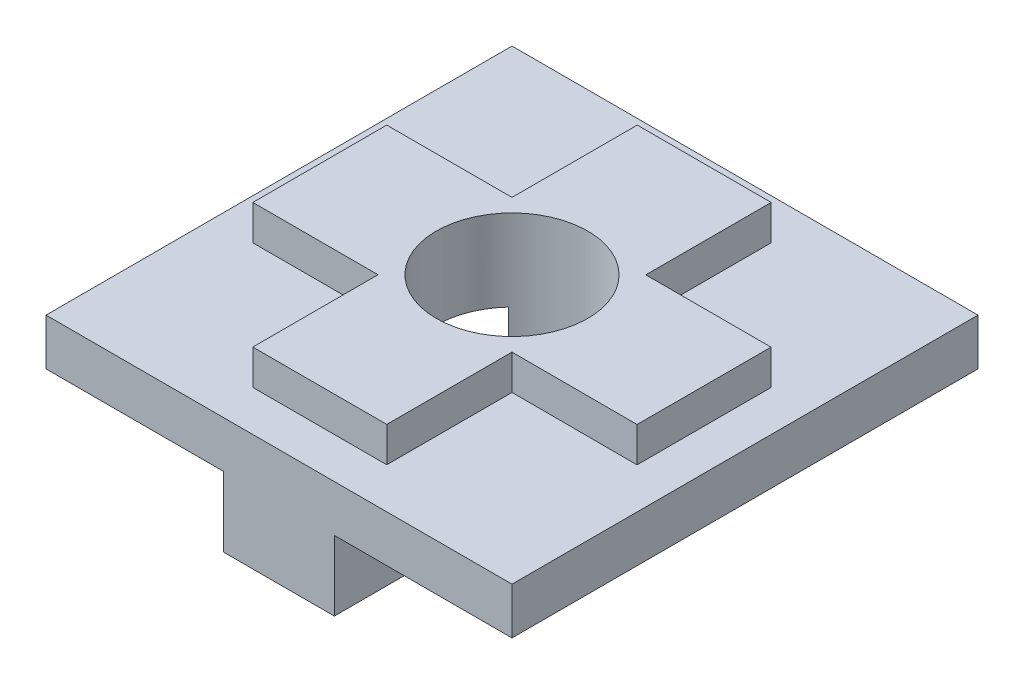
ISO-10303-21;
HEADER;
FILE_DESCRIPTION(('STEP AP214'),'2;1');
FILE_NAME('part.step','',(''),(''),'','','');
FILE_SCHEMA(('AUTOMOTIVE_DESIGN { 1 0 10303 214 1 1 1 1 }'));
ENDSEC;
DATA;
#1=APPLICATION_CONTEXT('core data for automotive mechanical design processes');
#2=APPLICATION_PROTOCOL_DEFINITION('international standard','automotive_design',2000,#1);
#3=PRODUCT_CONTEXT('',#1,'mechanical');
#4=PRODUCT('Part','Part','',(#3));
#5=PRODUCT_RELATED_PRODUCT_CATEGORY('part','',(#4));
#6=PRODUCT_DEFINITION_FORMATION('','',#4);
#7=PRODUCT_DEFINITION_CONTEXT('part definition',#1,'design');
#8=PRODUCT_DEFINITION('design','',#6,#7);
#9=PRODUCT_DEFINITION_SHAPE('','',#8);
#10=(LENGTH_UNIT() NAMED_UNIT(*) SI_UNIT(.MILLI.,.METRE.));
#11=(NAMED_UNIT(*) PLANE_ANGLE_UNIT() SI_UNIT($,.RADIAN.));
#12=(NAMED_UNIT(*) SI_UNIT($,.STERADIAN.) SOLID_ANGLE_UNIT());
#13=UNCERTAINTY_MEASURE_WITH_UNIT(LENGTH_MEASURE(1.E-05),#10,'distance_accuracy_value','');
#14=(GEOMETRIC_REPRESENTATION_CONTEXT(3) GLOBAL_UNCERTAINTY_ASSIGNED_CONTEXT((#13)) GLOBAL_UNIT_ASSIGNED_CONTEXT((#10,
#11,#12)) REPRESENTATION_CONTEXT('',''));
#15=CARTESIAN_POINT('',(0.,0.,0.));
#16=DIRECTION('',(0.,0.,1.));
#17=DIRECTION('',(1.,0.,0.));
#18=AXIS2_PLACEMENT_3D('',#15,#16,#17);
#19=CARTESIAN_POINT('',(2.375,-3.,10.));
#20=DIRECTION('',(-1.,0.,0.));
#21=DIRECTION('',(0.,0.,1.));
#22=AXIS2_PLACEMENT_3D('',#19,#20,#21);
#23=PLANE('',#22);
#24=DIRECTION('',(0.,0.,1.));
#25=VECTOR('',#24,1.);
#26=CARTESIAN_POINT('',(2.375,-3.,10.));
#27=LINE('',#26,#25);
#28=CARTESIAN_POINT('',(2.375,-3.,2.21852991866235));
#29=VERTEX_POINT('',#28);
#30=CARTESIAN_POINT('',(2.375,-3.,10.));
#31=VERTEX_POINT('',#30);
#32=EDGE_CURVE('E227',#29,#31,#27,.T.);
#33=ORIENTED_EDGE('',*,*,#32,.F.);
#34=DIRECTION('',(0.,1.,0.));
#35=VECTOR('',#34,1.);
#36=CARTESIAN_POINT('',(2.375,3.5,2.21852991866236));
#37=LINE('',#36,#35);
#38=CARTESIAN_POINT('',(2.375,0.,2.21852991866236));
#39=VERTEX_POINT('',#38);
#40=EDGE_CURVE('E55',#29,#39,#37,.T.);
#41=ORIENTED_EDGE('',*,*,#40,.T.);
#42=DIRECTION('',(0.,0.,1.));
#43=VECTOR('',#42,1.);
#44=CARTESIAN_POINT('',(2.375,0.,10.));
#45=LINE('',#44,#43);
#46=CARTESIAN_POINT('',(2.375,0.,10.));
#47=VERTEX_POINT('',#46);
#48=EDGE_CURVE('E247',#39,#47,#45,.T.);
#49=ORIENTED_EDGE('',*,*,#48,.T.);
#50=DIRECTION('',(0.,1.,0.));
#51=VECTOR('',#50,1.);
#52=CARTESIAN_POINT('',(2.375,-3.,10.));
#53=LINE('',#52,#51);
#54=EDGE_CURVE('E261',#31,#47,#53,.T.);
#55=ORIENTED_EDGE('',*,*,#54,.F.);
#56=EDGE_LOOP('',(#33,#41,#49,#55));
#57=FACE_BOUND('',#56,.T.);
#58=ADVANCED_FACE('F39',(#57),#23,.F.);
#59=CARTESIAN_POINT('',(-2.375,-3.,10.));
#60=DIRECTION('',(1.,0.,0.));
#61=DIRECTION('',(0.,0.,-1.));
#62=AXIS2_PLACEMENT_3D('',#59,#60,#61);
#63=PLANE('',#62);
#64=DIRECTION('',(0.,0.,-1.));
#65=VECTOR('',#64,1.);
#66=CARTESIAN_POINT('',(-2.375,-3.,10.));
#67=LINE('',#66,#65);
#68=CARTESIAN_POINT('',(-2.375,-3.,-2.21852991866235));
#69=VERTEX_POINT('',#68);
#70=CARTESIAN_POINT('',(-2.375,-3.,-10.));
#71=VERTEX_POINT('',#70);
#72=EDGE_CURVE('E231',#69,#71,#67,.T.);
#73=ORIENTED_EDGE('',*,*,#72,.F.);
#74=DIRECTION('',(0.,1.,0.));
#75=VECTOR('',#74,1.);
#76=CARTESIAN_POINT('',(-2.375,3.5,-2.21852991866236));
#77=LINE('',#76,#75);
#78=CARTESIAN_POINT('',(-2.375,0.,-2.21852991866236));
#79=VERTEX_POINT('',#78);
#80=EDGE_CURVE('E205',#69,#79,#77,.T.);
#81=ORIENTED_EDGE('',*,*,#80,.T.);
#82=DIRECTION('',(0.,0.,-1.));
#83=VECTOR('',#82,1.);
#84=CARTESIAN_POINT('',(-2.375,0.,10.));
#85=LINE('',#84,#83);
#86=CARTESIAN_POINT('',(-2.375,0.,-10.));
#87=VERTEX_POINT('',#86);
#88=EDGE_CURVE('E246',#79,#87,#85,.T.);
#89=ORIENTED_EDGE('',*,*,#88,.T.);
#90=DIRECTION('',(0.,1.,0.));
#91=VECTOR('',#90,1.);
#92=CARTESIAN_POINT('',(-2.375,-3.,-10.));
#93=LINE('',#92,#91);
#94=EDGE_CURVE('E253',#71,#87,#93,.T.);
#95=ORIENTED_EDGE('',*,*,#94,.F.);
#96=EDGE_LOOP('',(#73,#81,#89,#95));
#97=FACE_BOUND('',#96,.T.);
#98=ADVANCED_FACE('F474',(#97),#63,.F.);
#99=CARTESIAN_POINT('',(0.,-3.,0.));
#100=DIRECTION('',(0.,-1.,0.));
#101=DIRECTION('',(0.,0.,-1.));
#102=AXIS2_PLACEMENT_3D('',#99,#100,#101);
#103=PLANE('',#102);
#104=CARTESIAN_POINT('',(2.375,-3.,-10.));
#105=VERTEX_POINT('',#104);
#106=CARTESIAN_POINT('',(2.375,-3.,-2.21852991866235));
#107=VERTEX_POINT('',#106);
#108=EDGE_CURVE('E217',#105,#107,#27,.T.);
#109=ORIENTED_EDGE('',*,*,#108,.T.);
#110=CARTESIAN_POINT('',(0.,-3.,0.));
#111=DIRECTION('',(0.,1.,0.));
#112=DIRECTION('',(0.,0.,1.));
#113=AXIS2_PLACEMENT_3D('',#110,#111,#112);
#114=CIRCLE('',#113,3.25);
#115=EDGE_CURVE('E200',#107,#69,#114,.T.);
#116=ORIENTED_EDGE('',*,*,#115,.T.);
#117=ORIENTED_EDGE('',*,*,#72,.T.);
#118=DIRECTION('',(1.,0.,0.));
#119=VECTOR('',#118,1.);
#120=CARTESIAN_POINT('',(-2.375,-3.,-10.));
#121=LINE('',#120,#119);
#122=EDGE_CURVE('E223',#71,#105,#121,.T.);
#123=ORIENTED_EDGE('',*,*,#122,.T.);
#124=EDGE_LOOP('',(#109,#116,#117,#123));
#125=FACE_BOUND('',#124,.T.);
#126=ADVANCED_FACE('F221',(#125),#103,.T.);
#127=CARTESIAN_POINT('',(-2.375,-3.,10.));
#128=VERTEX_POINT('',#127);
#129=CARTESIAN_POINT('',(-2.375,-3.,2.21852991866235));
#130=VERTEX_POINT('',#129);
#131=EDGE_CURVE('E237',#128,#130,#67,.T.);
#132=ORIENTED_EDGE('',*,*,#131,.T.);
#133=EDGE_CURVE('E211',#130,#29,#114,.T.);
#134=ORIENTED_EDGE('',*,*,#133,.T.);
#135=ORIENTED_EDGE('',*,*,#32,.T.);
#136=DIRECTION('',(-1.,0.,0.));
#137=VECTOR('',#136,1.);
#138=CARTESIAN_POINT('',(-2.375,-3.,10.));
#139=LINE('',#138,#137);
#140=EDGE_CURVE('E226',#31,#128,#139,.T.);
#141=ORIENTED_EDGE('',*,*,#140,.T.);
#142=EDGE_LOOP('',(#132,#134,#135,#141));
#143=FACE_BOUND('',#142,.T.);
#144=ADVANCED_FACE('F459',(#143),#103,.T.);
#145=CARTESIAN_POINT('',(0.,0.,0.));
#146=DIRECTION('',(0.,1.,0.));
#147=DIRECTION('',(0.,0.,1.));
#148=AXIS2_PLACEMENT_3D('',#145,#146,#147);
#149=PLANE('',#148);
#150=ORIENTED_EDGE('',*,*,#48,.F.);
#151=CARTESIAN_POINT('',(0.,0.,0.));
#152=DIRECTION('',(0.,1.,0.));
#153=DIRECTION('',(0.,0.,1.));
#154=AXIS2_PLACEMENT_3D('',#151,#152,#153);
#155=CIRCLE('',#154,3.25);
#156=CARTESIAN_POINT('',(2.375,0.,-2.21852991866236));
#157=VERTEX_POINT('',#156);
#158=EDGE_CURVE('E219',#39,#157,#155,.T.);
#159=ORIENTED_EDGE('',*,*,#158,.T.);
#160=CARTESIAN_POINT('',(2.375,0.,-10.));
#161=VERTEX_POINT('',#160);
#162=EDGE_CURVE('E63',#161,#157,#45,.T.);
#163=ORIENTED_EDGE('',*,*,#162,.F.);
#164=DIRECTION('',(-1.,0.,0.));
#165=VECTOR('',#164,1.);
#166=CARTESIAN_POINT('',(-10.,0.,-10.));
#167=LINE('',#166,#165);
#168=CARTESIAN_POINT('',(10.,0.,-10.));
#169=VERTEX_POINT('',#168);
#170=EDGE_CURVE('E418',#169,#161,#167,.T.);
#171=ORIENTED_EDGE('',*,*,#170,.F.);
#172=DIRECTION('',(0.,0.,-1.));
#173=VECTOR('',#172,1.);
#174=CARTESIAN_POINT('',(10.,0.,-10.));
#175=LINE('',#174,#173);
#176=CARTESIAN_POINT('',(10.,0.,10.));
#177=VERTEX_POINT('',#176);
#178=EDGE_CURVE('E398',#177,#169,#175,.T.);
#179=ORIENTED_EDGE('',*,*,#178,.F.);
#180=DIRECTION('',(1.,0.,0.));
#181=VECTOR('',#180,1.);
#182=CARTESIAN_POINT('',(-10.,0.,10.));
#183=LINE('',#182,#181);
#184=EDGE_CURVE('E424',#47,#177,#183,.T.);
#185=ORIENTED_EDGE('',*,*,#184,.F.);
#186=EDGE_LOOP('',(#150,#159,#163,#171,#179,#185));
#187=FACE_BOUND('',#186,.T.);
#188=ADVANCED_FACE('F467',(#187),#149,.F.);
#189=ORIENTED_EDGE('',*,*,#88,.F.);
#190=CARTESIAN_POINT('',(0.,0.,0.));
#191=DIRECTION('',(0.,1.,0.));
#192=DIRECTION('',(0.,0.,1.));
#193=AXIS2_PLACEMENT_3D('',#190,#191,#192);
#194=CIRCLE('',#193,3.25);
#195=CARTESIAN_POINT('',(-2.375,0.,2.21852991866236));
#196=VERTEX_POINT('',#195);
#197=EDGE_CURVE('E713',#79,#196,#194,.T.);
#198=ORIENTED_EDGE('',*,*,#197,.T.);
#199=CARTESIAN_POINT('',(-2.375,0.,10.));
#200=VERTEX_POINT('',#199);
#201=EDGE_CURVE('E233',#200,#196,#85,.T.);
#202=ORIENTED_EDGE('',*,*,#201,.F.);
#203=CARTESIAN_POINT('',(-10.,0.,10.));
#204=VERTEX_POINT('',#203);
#205=EDGE_CURVE('E404',#204,#200,#183,.T.);
#206=ORIENTED_EDGE('',*,*,#205,.F.);
#207=DIRECTION('',(0.,0.,1.));
#208=VECTOR('',#207,1.);
#209=CARTESIAN_POINT('',(-10.,0.,-10.));
#210=LINE('',#209,#208);
#211=CARTESIAN_POINT('',(-10.,0.,-10.));
#212=VERTEX_POINT('',#211);
#213=EDGE_CURVE('E421',#212,#204,#210,.T.);
#214=ORIENTED_EDGE('',*,*,#213,.F.);
#215=EDGE_CURVE('E417',#87,#212,#167,.T.);
#216=ORIENTED_EDGE('',*,*,#215,.F.);
#217=EDGE_LOOP('',(#189,#198,#202,#206,#214,#216));
#218=FACE_BOUND('',#217,.T.);
#219=ADVANCED_FACE('F447',(#218),#149,.F.);
#220=CARTESIAN_POINT('',(10.,2.,-10.));
#221=DIRECTION('',(-1.,0.,0.));
#222=DIRECTION('',(0.,0.,1.));
#223=AXIS2_PLACEMENT_3D('',#220,#221,#222);
#224=PLANE('',#223);
#225=ORIENTED_EDGE('',*,*,#178,.T.);
#226=DIRECTION('',(0.,-1.,0.));
#227=VECTOR('',#226,1.);
#228=CARTESIAN_POINT('',(10.,2.,-10.));
#229=LINE('',#228,#227);
#230=CARTESIAN_POINT('',(10.,2.,-10.));
#231=VERTEX_POINT('',#230);
#232=EDGE_CURVE('E11',#231,#169,#229,.T.);
#233=ORIENTED_EDGE('',*,*,#232,.F.);
#234=DIRECTION('',(0.,0.,-1.));
#235=VECTOR('',#234,1.);
#236=CARTESIAN_POINT('',(10.,2.,-10.));
#237=LINE('',#236,#235);
#238=CARTESIAN_POINT('',(10.,2.,10.));
#239=VERTEX_POINT('',#238);
#240=EDGE_CURVE('E399',#239,#231,#237,.T.);
#241=ORIENTED_EDGE('',*,*,#240,.F.);
#242=DIRECTION('',(0.,-1.,0.));
#243=VECTOR('',#242,1.);
#244=CARTESIAN_POINT('',(10.,2.,10.));
#245=LINE('',#244,#243);
#246=EDGE_CURVE('E413',#239,#177,#245,.T.);
#247=ORIENTED_EDGE('',*,*,#246,.T.);
#248=EDGE_LOOP('',(#225,#233,#241,#247));
#249=FACE_BOUND('',#248,.T.);
#250=ADVANCED_FACE('F41',(#249),#224,.F.);
#251=CARTESIAN_POINT('',(-10.,2.,-10.));
#252=DIRECTION('',(0.,0.,1.));
#253=DIRECTION('',(1.,0.,0.));
#254=AXIS2_PLACEMENT_3D('',#251,#252,#253);
#255=PLANE('',#254);
#256=ORIENTED_EDGE('',*,*,#170,.T.);
#257=DIRECTION('',(0.,1.,0.));
#258=VECTOR('',#257,1.);
#259=CARTESIAN_POINT('',(2.375,-3.,-10.));
#260=LINE('',#259,#258);
#261=EDGE_CURVE('E243',#105,#161,#260,.T.);
#262=ORIENTED_EDGE('',*,*,#261,.F.);
#263=ORIENTED_EDGE('',*,*,#122,.F.);
#264=ORIENTED_EDGE('',*,*,#94,.T.);
#265=ORIENTED_EDGE('',*,*,#215,.T.);
#266=DIRECTION('',(0.,-1.,0.));
#267=VECTOR('',#266,1.);
#268=CARTESIAN_POINT('',(-10.,2.,-10.));
#269=LINE('',#268,#267);
#270=CARTESIAN_POINT('',(-10.,2.,-10.));
#271=VERTEX_POINT('',#270);
#272=EDGE_CURVE('E48',#271,#212,#269,.T.);
#273=ORIENTED_EDGE('',*,*,#272,.F.);
#274=DIRECTION('',(-1.,0.,0.));
#275=VECTOR('',#274,1.);
#276=CARTESIAN_POINT('',(-10.,2.,-10.));
#277=LINE('',#276,#275);
#278=EDGE_CURVE('E403',#231,#271,#277,.T.);
#279=ORIENTED_EDGE('',*,*,#278,.F.);
#280=ORIENTED_EDGE('',*,*,#232,.T.);
#281=EDGE_LOOP('',(#256,#262,#263,#264,#265,#273,#279,#280));
#282=FACE_BOUND('',#281,.T.);
#283=ADVANCED_FACE('F475',(#282),#255,.F.);
#284=CARTESIAN_POINT('',(-10.,2.,-10.));
#285=DIRECTION('',(1.,0.,0.));
#286=DIRECTION('',(0.,0.,-1.));
#287=AXIS2_PLACEMENT_3D('',#284,#285,#286);
#288=PLANE('',#287);
#289=ORIENTED_EDGE('',*,*,#213,.T.);
#290=DIRECTION('',(0.,-1.,0.));
#291=VECTOR('',#290,1.);
#292=CARTESIAN_POINT('',(-10.,2.,10.));
#293=LINE('',#292,#291);
#294=CARTESIAN_POINT('',(-10.,2.,10.));
#295=VERTEX_POINT('',#294);
#296=EDGE_CURVE('E431',#295,#204,#293,.T.);
#297=ORIENTED_EDGE('',*,*,#296,.F.);
#298=DIRECTION('',(0.,0.,1.));
#299=VECTOR('',#298,1.);
#300=CARTESIAN_POINT('',(-10.,2.,-10.));
#301=LINE('',#300,#299);
#302=EDGE_CURVE('E407',#271,#295,#301,.T.);
#303=ORIENTED_EDGE('',*,*,#302,.F.);
#304=ORIENTED_EDGE('',*,*,#272,.T.);
#305=EDGE_LOOP('',(#289,#297,#303,#304));
#306=FACE_BOUND('',#305,.T.);
#307=ADVANCED_FACE('F440',(#306),#288,.F.);
#308=CARTESIAN_POINT('',(-10.,2.,10.));
#309=DIRECTION('',(0.,0.,-1.));
#310=DIRECTION('',(-1.,0.,0.));
#311=AXIS2_PLACEMENT_3D('',#308,#309,#310);
#312=PLANE('',#311);
#313=ORIENTED_EDGE('',*,*,#205,.T.);
#314=DIRECTION('',(0.,1.,0.));
#315=VECTOR('',#314,1.);
#316=CARTESIAN_POINT('',(-2.375,-3.,10.));
#317=LINE('',#316,#315);
#318=EDGE_CURVE('E257',#128,#200,#317,.T.);
#319=ORIENTED_EDGE('',*,*,#318,.F.);
#320=ORIENTED_EDGE('',*,*,#140,.F.);
#321=ORIENTED_EDGE('',*,*,#54,.T.);
#322=ORIENTED_EDGE('',*,*,#184,.T.);
#323=ORIENTED_EDGE('',*,*,#246,.F.);
#324=DIRECTION('',(1.,0.,0.));
#325=VECTOR('',#324,1.);
#326=CARTESIAN_POINT('',(-10.,2.,10.));
#327=LINE('',#326,#325);
#328=EDGE_CURVE('E410',#295,#239,#327,.T.);
#329=ORIENTED_EDGE('',*,*,#328,.F.);
#330=ORIENTED_EDGE('',*,*,#296,.T.);
#331=EDGE_LOOP('',(#313,#319,#320,#321,#322,#323,#329,#330));
#332=FACE_BOUND('',#331,.T.);
#333=ADVANCED_FACE('F451',(#332),#312,.F.);
#334=CARTESIAN_POINT('',(0.,2.,0.));
#335=DIRECTION('',(0.,1.,0.));
#336=DIRECTION('',(0.,0.,1.));
#337=AXIS2_PLACEMENT_3D('',#334,#335,#336);
#338=PLANE('',#337);
#339=DIRECTION('',(0.,0.,1.));
#340=VECTOR('',#339,1.);
#341=CARTESIAN_POINT('',(-2.875,2.,-8.25));
#342=LINE('',#341,#340);
#343=CARTESIAN_POINT('',(-2.875,2.,-8.25));
#344=VERTEX_POINT('',#343);
#345=CARTESIAN_POINT('',(-2.875,2.,-2.875));
#346=VERTEX_POINT('',#345);
#347=EDGE_CURVE('E265',#344,#346,#342,.T.);
#348=ORIENTED_EDGE('',*,*,#347,.F.);
#349=DIRECTION('',(-1.,0.,0.));
#350=VECTOR('',#349,1.);
#351=CARTESIAN_POINT('',(-2.875,2.,-8.25));
#352=LINE('',#351,#350);
#353=CARTESIAN_POINT('',(2.875,2.,-8.25));
#354=VERTEX_POINT('',#353);
#355=EDGE_CURVE('E271',#354,#344,#352,.T.);
#356=ORIENTED_EDGE('',*,*,#355,.F.);
#357=DIRECTION('',(0.,0.,-1.));
#358=VECTOR('',#357,1.);
#359=CARTESIAN_POINT('',(2.875,2.,-2.86747496323573));
#360=LINE('',#359,#358);
#361=CARTESIAN_POINT('',(2.875,2.,-2.86747496323573));
#362=VERTEX_POINT('',#361);
#363=EDGE_CURVE('E344',#362,#354,#360,.T.);
#364=ORIENTED_EDGE('',*,*,#363,.F.);
#365=DIRECTION('',(-1.,0.,0.));
#366=VECTOR('',#365,1.);
#367=CARTESIAN_POINT('',(8.25,2.,-2.86747496323573));
#368=LINE('',#367,#366);
#369=CARTESIAN_POINT('',(8.25,2.,-2.86747496323573));
#370=VERTEX_POINT('',#369);
#371=EDGE_CURVE('E340',#370,#362,#368,.T.);
#372=ORIENTED_EDGE('',*,*,#371,.F.);
#373=DIRECTION('',(0.,0.,-1.));
#374=VECTOR('',#373,1.);
#375=CARTESIAN_POINT('',(8.25,2.,2.88252503676427));
#376=LINE('',#375,#374);
#377=CARTESIAN_POINT('',(8.25,2.,2.88252503676427));
#378=VERTEX_POINT('',#377);
#379=EDGE_CURVE('E336',#378,#370,#376,.T.);
#380=ORIENTED_EDGE('',*,*,#379,.F.);
#381=DIRECTION('',(0.999999019991865,0.,0.00140000546784625));
#382=VECTOR('',#381,1.);
#383=CARTESIAN_POINT('',(2.875,2.,2.875));
#384=LINE('',#383,#382);
#385=CARTESIAN_POINT('',(2.875,2.,2.875));
#386=VERTEX_POINT('',#385);
#387=EDGE_CURVE('E332',#386,#378,#384,.T.);
#388=ORIENTED_EDGE('',*,*,#387,.F.);
#389=DIRECTION('',(0.,0.,-1.));
#390=VECTOR('',#389,1.);
#391=CARTESIAN_POINT('',(2.875,2.,8.25));
#392=LINE('',#391,#390);
#393=CARTESIAN_POINT('',(2.875,2.,8.25));
#394=VERTEX_POINT('',#393);
#395=EDGE_CURVE('E328',#394,#386,#392,.T.);
#396=ORIENTED_EDGE('',*,*,#395,.F.);
#397=DIRECTION('',(1.,0.,0.));
#398=VECTOR('',#397,1.);
#399=CARTESIAN_POINT('',(-2.875,2.,8.25));
#400=LINE('',#399,#398);
#401=CARTESIAN_POINT('',(-2.875,2.,8.25));
#402=VERTEX_POINT('',#401);
#403=EDGE_CURVE('E324',#402,#394,#400,.T.);
#404=ORIENTED_EDGE('',*,*,#403,.F.);
#405=DIRECTION('',(0.,0.,1.));
#406=VECTOR('',#405,1.);
#407=CARTESIAN_POINT('',(-2.875,2.,2.875));
#408=LINE('',#407,#406);
#409=CARTESIAN_POINT('',(-2.875,2.,2.875));
#410=VERTEX_POINT('',#409);
#411=EDGE_CURVE('E320',#410,#402,#408,.T.);
#412=ORIENTED_EDGE('',*,*,#411,.F.);
#413=DIRECTION('',(1.,0.,0.));
#414=VECTOR('',#413,1.);
#415=CARTESIAN_POINT('',(-8.25,2.,2.875));
#416=LINE('',#415,#414);
#417=CARTESIAN_POINT('',(-8.25,2.,2.875));
#418=VERTEX_POINT('',#417);
#419=EDGE_CURVE('E316',#418,#410,#416,.T.);
#420=ORIENTED_EDGE('',*,*,#419,.F.);
#421=DIRECTION('',(0.,0.,1.));
#422=VECTOR('',#421,1.);
#423=CARTESIAN_POINT('',(-8.25,2.,2.875));
#424=LINE('',#423,#422);
#425=CARTESIAN_POINT('',(-8.25,2.,-2.875));
#426=VERTEX_POINT('',#425);
#427=EDGE_CURVE('E312',#426,#418,#424,.T.);
#428=ORIENTED_EDGE('',*,*,#427,.F.);
#429=DIRECTION('',(-1.,0.,0.));
#430=VECTOR('',#429,1.);
#431=CARTESIAN_POINT('',(-2.875,2.,-2.875));
#432=LINE('',#431,#430);
#433=EDGE_CURVE('E308',#346,#426,#432,.T.);
#434=ORIENTED_EDGE('',*,*,#433,.F.);
#435=EDGE_LOOP('',(#348,#356,#364,#372,#380,#388,#396,#404,#412,#420,#428,#434));
#436=FACE_BOUND('',#435,.T.);
#437=ORIENTED_EDGE('',*,*,#240,.T.);
#438=ORIENTED_EDGE('',*,*,#278,.T.);
#439=ORIENTED_EDGE('',*,*,#302,.T.);
#440=ORIENTED_EDGE('',*,*,#328,.T.);
#441=EDGE_LOOP('',(#437,#438,#439,#440));
#442=FACE_BOUND('',#441,.T.);
#443=ADVANCED_FACE('F480',(#436,#442),#338,.T.);
#444=CARTESIAN_POINT('',(-2.875,3.5,-8.25));
#445=DIRECTION('',(1.,0.,0.));
#446=DIRECTION('',(0.,0.,-1.));
#447=AXIS2_PLACEMENT_3D('',#444,#445,#446);
#448=PLANE('',#447);
#449=ORIENTED_EDGE('',*,*,#347,.T.);
#450=DIRECTION('',(0.,-1.,0.));
#451=VECTOR('',#450,1.);
#452=CARTESIAN_POINT('',(-2.875,3.5,-2.875));
#453=LINE('',#452,#451);
#454=CARTESIAN_POINT('',(-2.875,3.5,-2.875));
#455=VERTEX_POINT('',#454);
#456=EDGE_CURVE('E394',#455,#346,#453,.T.);
#457=ORIENTED_EDGE('',*,*,#456,.F.);
#458=DIRECTION('',(0.,0.,1.));
#459=VECTOR('',#458,1.);
#460=CARTESIAN_POINT('',(-2.875,3.5,-8.25));
#461=LINE('',#460,#459);
#462=CARTESIAN_POINT('',(-2.875,3.5,-8.25));
#463=VERTEX_POINT('',#462);
#464=EDGE_CURVE('E266',#463,#455,#461,.T.);
#465=ORIENTED_EDGE('',*,*,#464,.F.);
#466=DIRECTION('',(0.,-1.,0.));
#467=VECTOR('',#466,1.);
#468=CARTESIAN_POINT('',(-2.875,3.5,-8.25));
#469=LINE('',#468,#467);
#470=EDGE_CURVE('E304',#463,#344,#469,.T.);
#471=ORIENTED_EDGE('',*,*,#470,.T.);
#472=EDGE_LOOP('',(#449,#457,#465,#471));
#473=FACE_BOUND('',#472,.T.);
#474=ADVANCED_FACE('F482',(#473),#448,.F.);
#475=CARTESIAN_POINT('',(-2.875,3.5,-2.875));
#476=DIRECTION('',(0.,0.,1.));
#477=DIRECTION('',(1.,0.,0.));
#478=AXIS2_PLACEMENT_3D('',#475,#476,#477);
#479=PLANE('',#478);
#480=ORIENTED_EDGE('',*,*,#433,.T.);
#481=DIRECTION('',(0.,-1.,0.));
#482=VECTOR('',#481,1.);
#483=CARTESIAN_POINT('',(-8.25,3.5,-2.875));
#484=LINE('',#483,#482);
#485=CARTESIAN_POINT('',(-8.25,3.5,-2.875));
#486=VERTEX_POINT('',#485);
#487=EDGE_CURVE('E390',#486,#426,#484,.T.);
#488=ORIENTED_EDGE('',*,*,#487,.F.);
#489=DIRECTION('',(-1.,0.,0.));
#490=VECTOR('',#489,1.);
#491=CARTESIAN_POINT('',(-2.875,3.5,-2.875));
#492=LINE('',#491,#490);
#493=EDGE_CURVE('E270',#455,#486,#492,.T.);
#494=ORIENTED_EDGE('',*,*,#493,.F.);
#495=ORIENTED_EDGE('',*,*,#456,.T.);
#496=EDGE_LOOP('',(#480,#488,#494,#495));
#497=FACE_BOUND('',#496,.T.);
#498=ADVANCED_FACE('F489',(#497),#479,.F.);
#499=CARTESIAN_POINT('',(-8.25,3.5,2.875));
#500=DIRECTION('',(1.,0.,0.));
#501=DIRECTION('',(0.,0.,-1.));
#502=AXIS2_PLACEMENT_3D('',#499,#500,#501);
#503=PLANE('',#502);
#504=ORIENTED_EDGE('',*,*,#427,.T.);
#505=DIRECTION('',(0.,-1.,0.));
#506=VECTOR('',#505,1.);
#507=CARTESIAN_POINT('',(-8.25,3.5,2.875));
#508=LINE('',#507,#506);
#509=CARTESIAN_POINT('',(-8.25,3.5,2.875));
#510=VERTEX_POINT('',#509);
#511=EDGE_CURVE('E386',#510,#418,#508,.T.);
#512=ORIENTED_EDGE('',*,*,#511,.F.);
#513=DIRECTION('',(0.,0.,1.));
#514=VECTOR('',#513,1.);
#515=CARTESIAN_POINT('',(-8.25,3.5,2.875));
#516=LINE('',#515,#514);
#517=EDGE_CURVE('E274',#486,#510,#516,.T.);
#518=ORIENTED_EDGE('',*,*,#517,.F.);
#519=ORIENTED_EDGE('',*,*,#487,.T.);
#520=EDGE_LOOP('',(#504,#512,#518,#519));
#521=FACE_BOUND('',#520,.T.);
#522=ADVANCED_FACE('F548',(#521),#503,.F.);
#523=CARTESIAN_POINT('',(-8.25,3.5,2.875));
#524=DIRECTION('',(0.,0.,-1.));
#525=DIRECTION('',(-1.,0.,0.));
#526=AXIS2_PLACEMENT_3D('',#523,#524,#525);
#527=PLANE('',#526);
#528=ORIENTED_EDGE('',*,*,#419,.T.);
#529=DIRECTION('',(0.,-1.,0.));
#530=VECTOR('',#529,1.);
#531=CARTESIAN_POINT('',(-2.875,3.5,2.875));
#532=LINE('',#531,#530);
#533=CARTESIAN_POINT('',(-2.875,3.5,2.875));
#534=VERTEX_POINT('',#533);
#535=EDGE_CURVE('E382',#534,#410,#532,.T.);
#536=ORIENTED_EDGE('',*,*,#535,.F.);
#537=DIRECTION('',(1.,0.,0.));
#538=VECTOR('',#537,1.);
#539=CARTESIAN_POINT('',(-8.25,3.5,2.875));
#540=LINE('',#539,#538);
#541=EDGE_CURVE('E277',#510,#534,#540,.T.);
#542=ORIENTED_EDGE('',*,*,#541,.F.);
#543=ORIENTED_EDGE('',*,*,#511,.T.);
#544=EDGE_LOOP('',(#528,#536,#542,#543));
#545=FACE_BOUND('',#544,.T.);
#546=ADVANCED_FACE('F544',(#545),#527,.F.);
#547=CARTESIAN_POINT('',(-2.875,3.5,2.875));
#548=DIRECTION('',(1.,0.,0.));
#549=DIRECTION('',(0.,0.,-1.));
#550=AXIS2_PLACEMENT_3D('',#547,#548,#549);
#551=PLANE('',#550);
#552=ORIENTED_EDGE('',*,*,#411,.T.);
#553=DIRECTION('',(0.,-1.,0.));
#554=VECTOR('',#553,1.);
#555=CARTESIAN_POINT('',(-2.875,3.5,8.25));
#556=LINE('',#555,#554);
#557=CARTESIAN_POINT('',(-2.875,3.5,8.25));
#558=VERTEX_POINT('',#557);
#559=EDGE_CURVE('E378',#558,#402,#556,.T.);
#560=ORIENTED_EDGE('',*,*,#559,.F.);
#561=DIRECTION('',(0.,0.,1.));
#562=VECTOR('',#561,1.);
#563=CARTESIAN_POINT('',(-2.875,3.5,2.875));
#564=LINE('',#563,#562);
#565=EDGE_CURVE('E280',#534,#558,#564,.T.);
#566=ORIENTED_EDGE('',*,*,#565,.F.);
#567=ORIENTED_EDGE('',*,*,#535,.T.);
#568=EDGE_LOOP('',(#552,#560,#566,#567));
#569=FACE_BOUND('',#568,.T.);
#570=ADVANCED_FACE('F540',(#569),#551,.F.);
#571=CARTESIAN_POINT('',(-2.875,3.5,8.25));
#572=DIRECTION('',(0.,0.,-1.));
#573=DIRECTION('',(-1.,0.,0.));
#574=AXIS2_PLACEMENT_3D('',#571,#572,#573);
#575=PLANE('',#574);
#576=ORIENTED_EDGE('',*,*,#403,.T.);
#577=DIRECTION('',(0.,-1.,0.));
#578=VECTOR('',#577,1.);
#579=CARTESIAN_POINT('',(2.875,3.5,8.25));
#580=LINE('',#579,#578);
#581=CARTESIAN_POINT('',(2.875,3.5,8.25));
#582=VERTEX_POINT('',#581);
#583=EDGE_CURVE('E374',#582,#394,#580,.T.);
#584=ORIENTED_EDGE('',*,*,#583,.F.);
#585=DIRECTION('',(1.,0.,0.));
#586=VECTOR('',#585,1.);
#587=CARTESIAN_POINT('',(-2.875,3.5,8.25));
#588=LINE('',#587,#586);
#589=EDGE_CURVE('E283',#558,#582,#588,.T.);
#590=ORIENTED_EDGE('',*,*,#589,.F.);
#591=ORIENTED_EDGE('',*,*,#559,.T.);
#592=EDGE_LOOP('',(#576,#584,#590,#591));
#593=FACE_BOUND('',#592,.T.);
#594=ADVANCED_FACE('F536',(#593),#575,.F.);
#595=CARTESIAN_POINT('',(2.875,3.5,8.25));
#596=DIRECTION('',(-1.,0.,0.));
#597=DIRECTION('',(0.,0.,1.));
#598=AXIS2_PLACEMENT_3D('',#595,#596,#597);
#599=PLANE('',#598);
#600=ORIENTED_EDGE('',*,*,#395,.T.);
#601=DIRECTION('',(0.,-1.,0.));
#602=VECTOR('',#601,1.);
#603=CARTESIAN_POINT('',(2.875,3.5,2.875));
#604=LINE('',#603,#602);
#605=CARTESIAN_POINT('',(2.875,3.5,2.875));
#606=VERTEX_POINT('',#605);
#607=EDGE_CURVE('E370',#606,#386,#604,.T.);
#608=ORIENTED_EDGE('',*,*,#607,.F.);
#609=DIRECTION('',(0.,0.,-1.));
#610=VECTOR('',#609,1.);
#611=CARTESIAN_POINT('',(2.875,3.5,8.25));
#612=LINE('',#611,#610);
#613=EDGE_CURVE('E286',#582,#606,#612,.T.);
#614=ORIENTED_EDGE('',*,*,#613,.F.);
#615=ORIENTED_EDGE('',*,*,#583,.T.);
#616=EDGE_LOOP('',(#600,#608,#614,#615));
#617=FACE_BOUND('',#616,.T.);
#618=ADVANCED_FACE('F532',(#617),#599,.F.);
#619=CARTESIAN_POINT('',(2.875,3.5,2.875));
#620=DIRECTION('',(0.00140000546784625,0.,-0.999999019991865));
#621=DIRECTION('',(-0.999999019991865,0.,-0.00140000546784625));
#622=AXIS2_PLACEMENT_3D('',#619,#620,#621);
#623=PLANE('',#622);
#624=ORIENTED_EDGE('',*,*,#387,.T.);
#625=DIRECTION('',(0.,-1.,0.));
#626=VECTOR('',#625,1.);
#627=CARTESIAN_POINT('',(8.25,3.5,2.88252503676427));
#628=LINE('',#627,#626);
#629=CARTESIAN_POINT('',(8.25,3.5,2.88252503676427));
#630=VERTEX_POINT('',#629);
#631=EDGE_CURVE('E366',#630,#378,#628,.T.);
#632=ORIENTED_EDGE('',*,*,#631,.F.);
#633=DIRECTION('',(0.999999019991865,0.,0.00140000546784625));
#634=VECTOR('',#633,1.);
#635=CARTESIAN_POINT('',(2.875,3.5,2.875));
#636=LINE('',#635,#634);
#637=EDGE_CURVE('E289',#606,#630,#636,.T.);
#638=ORIENTED_EDGE('',*,*,#637,.F.);
#639=ORIENTED_EDGE('',*,*,#607,.T.);
#640=EDGE_LOOP('',(#624,#632,#638,#639));
#641=FACE_BOUND('',#640,.T.);
#642=ADVANCED_FACE('F528',(#641),#623,.F.);
#643=CARTESIAN_POINT('',(8.25,3.5,2.88252503676427));
#644=DIRECTION('',(-1.,0.,0.));
#645=DIRECTION('',(0.,0.,1.));
#646=AXIS2_PLACEMENT_3D('',#643,#644,#645);
#647=PLANE('',#646);
#648=ORIENTED_EDGE('',*,*,#379,.T.);
#649=DIRECTION('',(0.,-1.,0.));
#650=VECTOR('',#649,1.);
#651=CARTESIAN_POINT('',(8.25,3.5,-2.86747496323573));
#652=LINE('',#651,#650);
#653=CARTESIAN_POINT('',(8.25,3.5,-2.86747496323573));
#654=VERTEX_POINT('',#653);
#655=EDGE_CURVE('E362',#654,#370,#652,.T.);
#656=ORIENTED_EDGE('',*,*,#655,.F.);
#657=DIRECTION('',(0.,0.,-1.));
#658=VECTOR('',#657,1.);
#659=CARTESIAN_POINT('',(8.25,3.5,2.88252503676427));
#660=LINE('',#659,#658);
#661=EDGE_CURVE('E292',#630,#654,#660,.T.);
#662=ORIENTED_EDGE('',*,*,#661,.F.);
#663=ORIENTED_EDGE('',*,*,#631,.T.);
#664=EDGE_LOOP('',(#648,#656,#662,#663));
#665=FACE_BOUND('',#664,.T.);
#666=ADVANCED_FACE('F524',(#665),#647,.F.);
#667=CARTESIAN_POINT('',(8.25,3.5,-2.86747496323573));
#668=DIRECTION('',(0.,0.,1.));
#669=DIRECTION('',(1.,0.,0.));
#670=AXIS2_PLACEMENT_3D('',#667,#668,#669);
#671=PLANE('',#670);
#672=ORIENTED_EDGE('',*,*,#371,.T.);
#673=DIRECTION('',(0.,-1.,0.));
#674=VECTOR('',#673,1.);
#675=CARTESIAN_POINT('',(2.875,3.5,-2.86747496323573));
#676=LINE('',#675,#674);
#677=CARTESIAN_POINT('',(2.875,3.5,-2.86747496323573));
#678=VERTEX_POINT('',#677);
#679=EDGE_CURVE('E358',#678,#362,#676,.T.);
#680=ORIENTED_EDGE('',*,*,#679,.F.);
#681=DIRECTION('',(-1.,0.,0.));
#682=VECTOR('',#681,1.);
#683=CARTESIAN_POINT('',(8.25,3.5,-2.86747496323573));
#684=LINE('',#683,#682);
#685=EDGE_CURVE('E295',#654,#678,#684,.T.);
#686=ORIENTED_EDGE('',*,*,#685,.F.);
#687=ORIENTED_EDGE('',*,*,#655,.T.);
#688=EDGE_LOOP('',(#672,#680,#686,#687));
#689=FACE_BOUND('',#688,.T.);
#690=ADVANCED_FACE('F520',(#689),#671,.F.);
#691=CARTESIAN_POINT('',(2.875,3.5,-2.86747496323573));
#692=DIRECTION('',(-1.,0.,0.));
#693=DIRECTION('',(0.,0.,1.));
#694=AXIS2_PLACEMENT_3D('',#691,#692,#693);
#695=PLANE('',#694);
#696=ORIENTED_EDGE('',*,*,#363,.T.);
#697=DIRECTION('',(0.,-1.,0.));
#698=VECTOR('',#697,1.);
#699=CARTESIAN_POINT('',(2.875,3.5,-8.25));
#700=LINE('',#699,#698);
#701=CARTESIAN_POINT('',(2.875,3.5,-8.25));
#702=VERTEX_POINT('',#701);
#703=EDGE_CURVE('E354',#702,#354,#700,.T.);
#704=ORIENTED_EDGE('',*,*,#703,.F.);
#705=DIRECTION('',(0.,0.,-1.));
#706=VECTOR('',#705,1.);
#707=CARTESIAN_POINT('',(2.875,3.5,-2.86747496323573));
#708=LINE('',#707,#706);
#709=EDGE_CURVE('E298',#678,#702,#708,.T.);
#710=ORIENTED_EDGE('',*,*,#709,.F.);
#711=ORIENTED_EDGE('',*,*,#679,.T.);
#712=EDGE_LOOP('',(#696,#704,#710,#711));
#713=FACE_BOUND('',#712,.T.);
#714=ADVANCED_FACE('F512',(#713),#695,.F.);
#715=CARTESIAN_POINT('',(-2.875,3.5,-8.25));
#716=DIRECTION('',(0.,0.,1.));
#717=DIRECTION('',(1.,0.,0.));
#718=AXIS2_PLACEMENT_3D('',#715,#716,#717);
#719=PLANE('',#718);
#720=ORIENTED_EDGE('',*,*,#355,.T.);
#721=ORIENTED_EDGE('',*,*,#470,.F.);
#722=DIRECTION('',(-1.,0.,0.));
#723=VECTOR('',#722,1.);
#724=CARTESIAN_POINT('',(-2.875,3.5,-8.25));
#725=LINE('',#724,#723);
#726=EDGE_CURVE('E301',#702,#463,#725,.T.);
#727=ORIENTED_EDGE('',*,*,#726,.F.);
#728=ORIENTED_EDGE('',*,*,#703,.T.);
#729=EDGE_LOOP('',(#720,#721,#727,#728));
#730=FACE_BOUND('',#729,.T.);
#731=ADVANCED_FACE('F507',(#730),#719,.F.);
#732=CARTESIAN_POINT('',(0.,3.5,0.));
#733=DIRECTION('',(0.,-1.,0.));
#734=DIRECTION('',(0.,0.,-1.));
#735=AXIS2_PLACEMENT_3D('',#732,#733,#734);
#736=PLANE('',#735);
#737=CARTESIAN_POINT('',(0.,3.5,0.));
#738=DIRECTION('',(0.,1.,0.));
#739=DIRECTION('',(0.,0.,1.));
#740=AXIS2_PLACEMENT_3D('',#737,#738,#739);
#741=CIRCLE('',#740,3.25);
#742=CARTESIAN_POINT('',(0.,3.5,3.25));
#743=VERTEX_POINT('',#742);
#744=EDGE_CURVE('E706',#743,#743,#741,.T.);
#745=ORIENTED_EDGE('',*,*,#744,.F.);
#746=EDGE_LOOP('',(#745));
#747=FACE_BOUND('',#746,.T.);
#748=ORIENTED_EDGE('',*,*,#464,.T.);
#749=ORIENTED_EDGE('',*,*,#493,.T.);
#750=ORIENTED_EDGE('',*,*,#517,.T.);
#751=ORIENTED_EDGE('',*,*,#541,.T.);
#752=ORIENTED_EDGE('',*,*,#565,.T.);
#753=ORIENTED_EDGE('',*,*,#589,.T.);
#754=ORIENTED_EDGE('',*,*,#613,.T.);
#755=ORIENTED_EDGE('',*,*,#637,.T.);
#756=ORIENTED_EDGE('',*,*,#661,.T.);
#757=ORIENTED_EDGE('',*,*,#685,.T.);
#758=ORIENTED_EDGE('',*,*,#709,.T.);
#759=ORIENTED_EDGE('',*,*,#726,.T.);
#760=EDGE_LOOP('',(#748,#749,#750,#751,#752,#753,#754,#755,#756,#757,#758,#759));
#761=FACE_BOUND('',#760,.T.);
#762=ADVANCED_FACE('F502',(#747,#761),#736,.F.);
#763=ORIENTED_EDGE('',*,*,#162,.T.);
#764=DIRECTION('',(0.,1.,0.));
#765=VECTOR('',#764,1.);
#766=CARTESIAN_POINT('',(2.375,3.5,-2.21852991866236));
#767=LINE('',#766,#765);
#768=EDGE_CURVE('E203',#157,#107,#767,.F.);
#769=ORIENTED_EDGE('',*,*,#768,.T.);
#770=ORIENTED_EDGE('',*,*,#108,.F.);
#771=ORIENTED_EDGE('',*,*,#261,.T.);
#772=EDGE_LOOP('',(#763,#769,#770,#771));
#773=FACE_BOUND('',#772,.T.);
#774=ADVANCED_FACE('F215',(#773),#23,.F.);
#775=ORIENTED_EDGE('',*,*,#201,.T.);
#776=DIRECTION('',(0.,1.,0.));
#777=VECTOR('',#776,1.);
#778=CARTESIAN_POINT('',(-2.375,3.5,2.21852991866236));
#779=LINE('',#778,#777);
#780=EDGE_CURVE('E210',#196,#130,#779,.F.);
#781=ORIENTED_EDGE('',*,*,#780,.T.);
#782=ORIENTED_EDGE('',*,*,#131,.F.);
#783=ORIENTED_EDGE('',*,*,#318,.T.);
#784=EDGE_LOOP('',(#775,#781,#782,#783));
#785=FACE_BOUND('',#784,.T.);
#786=ADVANCED_FACE('F456',(#785),#63,.F.);
#787=CARTESIAN_POINT('',(0.,3.5,0.));
#788=DIRECTION('',(0.,1.,0.));
#789=DIRECTION('',(0.,0.,1.));
#790=AXIS2_PLACEMENT_3D('',#787,#788,#789);
#791=CYLINDRICAL_SURFACE('',#790,3.25);
#792=ORIENTED_EDGE('',*,*,#744,.T.);
#793=EDGE_LOOP('',(#792));
#794=FACE_BOUND('',#793,.T.);
#795=ORIENTED_EDGE('',*,*,#133,.F.);
#796=ORIENTED_EDGE('',*,*,#780,.F.);
#797=ORIENTED_EDGE('',*,*,#197,.F.);
#798=ORIENTED_EDGE('',*,*,#80,.F.);
#799=ORIENTED_EDGE('',*,*,#115,.F.);
#800=ORIENTED_EDGE('',*,*,#768,.F.);
#801=ORIENTED_EDGE('',*,*,#158,.F.);
#802=ORIENTED_EDGE('',*,*,#40,.F.);
#803=EDGE_LOOP('',(#795,#796,#797,#798,#799,#800,#801,#802));
#804=FACE_BOUND('',#803,.T.);
#805=ADVANCED_FACE('F202',(#794,#804),#791,.F.);
#806=CLOSED_SHELL('',(#58,#98,#126,#144,#188,#219,#250,#283,#307,#333,#443,#474,#498,#522,#546,
#570,#594,#618,#642,#666,#690,#714,#731,#762,#774,#786,#805));
#807=MANIFOLD_SOLID_BREP('B2',#806);
#808=ADVANCED_BREP_SHAPE_REPRESENTATION('',(#18,#807),#14);
#809=SHAPE_DEFINITION_REPRESENTATION(#9,#808);
ENDSEC;
END-ISO-10303-21;
